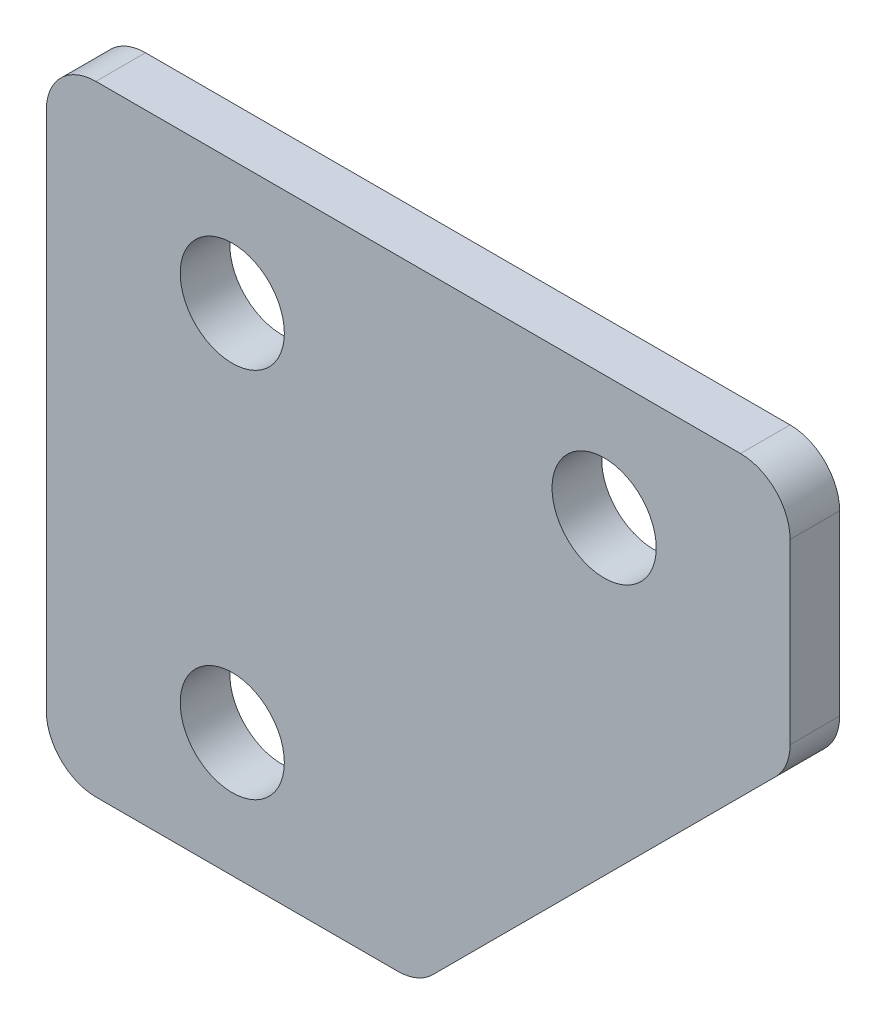
ISO-10303-21;
HEADER;
FILE_DESCRIPTION(('STEP AP214'),'2;1');
FILE_NAME('part.step','',(''),(''),'','','');
FILE_SCHEMA(('AUTOMOTIVE_DESIGN { 1 0 10303 214 1 1 1 1 }'));
ENDSEC;
DATA;
#1=APPLICATION_CONTEXT('core data for automotive mechanical design processes');
#2=APPLICATION_PROTOCOL_DEFINITION('international standard','automotive_design',2000,#1);
#3=PRODUCT_CONTEXT('',#1,'mechanical');
#4=PRODUCT('Part','Part','',(#3));
#5=PRODUCT_RELATED_PRODUCT_CATEGORY('part','',(#4));
#6=PRODUCT_DEFINITION_FORMATION('','',#4);
#7=PRODUCT_DEFINITION_CONTEXT('part definition',#1,'design');
#8=PRODUCT_DEFINITION('design','',#6,#7);
#9=PRODUCT_DEFINITION_SHAPE('','',#8);
#10=(LENGTH_UNIT() NAMED_UNIT(*) SI_UNIT(.MILLI.,.METRE.));
#11=(NAMED_UNIT(*) PLANE_ANGLE_UNIT() SI_UNIT($,.RADIAN.));
#12=(NAMED_UNIT(*) SI_UNIT($,.STERADIAN.) SOLID_ANGLE_UNIT());
#13=UNCERTAINTY_MEASURE_WITH_UNIT(LENGTH_MEASURE(1.E-05),#10,'distance_accuracy_value','');
#14=(GEOMETRIC_REPRESENTATION_CONTEXT(3) GLOBAL_UNCERTAINTY_ASSIGNED_CONTEXT((#13)) GLOBAL_UNIT_ASSIGNED_CONTEXT((#10,
#11,#12)) REPRESENTATION_CONTEXT('',''));
#15=CARTESIAN_POINT('',(0.,0.,0.));
#16=DIRECTION('',(0.,0.,1.));
#17=DIRECTION('',(1.,0.,0.));
#18=AXIS2_PLACEMENT_3D('',#15,#16,#17);
#19=CARTESIAN_POINT('',(13.75,-13.75,2.));
#20=DIRECTION('',(0.707106781186548,-0.707106781186547,0.));
#21=DIRECTION('',(0.707106781186547,0.707106781186548,0.));
#22=AXIS2_PLACEMENT_3D('',#19,#20,#21);
#23=PLANE('',#22);
#24=DIRECTION('',(-0.707106781186547,-0.707106781186548,0.));
#25=VECTOR('',#24,1.);
#26=CARTESIAN_POINT('',(13.75,-13.75,0.));
#27=LINE('',#26,#25);
#28=CARTESIAN_POINT('',(21.9142135623731,-5.58578643762691,0.));
#29=VERTEX_POINT('',#28);
#30=CARTESIAN_POINT('',(8.08578643762691,-19.4142135623731,0.));
#31=VERTEX_POINT('',#30);
#32=EDGE_CURVE('E205',#29,#31,#27,.T.);
#33=ORIENTED_EDGE('',*,*,#32,.F.);
#34=DIRECTION('',(0.,0.,-1.));
#35=VECTOR('',#34,1.);
#36=CARTESIAN_POINT('',(21.9142135623731,-5.58578643762691,2.));
#37=LINE('',#36,#35);
#38=CARTESIAN_POINT('',(21.9142135623731,-5.58578643762691,2.));
#39=VERTEX_POINT('',#38);
#40=EDGE_CURVE('E246',#29,#39,#37,.F.);
#41=ORIENTED_EDGE('',*,*,#40,.T.);
#42=DIRECTION('',(-0.707106781186547,-0.707106781186548,0.));
#43=VECTOR('',#42,1.);
#44=CARTESIAN_POINT('',(13.75,-13.75,2.));
#45=LINE('',#44,#43);
#46=CARTESIAN_POINT('',(8.08578643762691,-19.4142135623731,2.));
#47=VERTEX_POINT('',#46);
#48=EDGE_CURVE('E220',#39,#47,#45,.T.);
#49=ORIENTED_EDGE('',*,*,#48,.T.);
#50=DIRECTION('',(0.,0.,-1.));
#51=VECTOR('',#50,1.);
#52=CARTESIAN_POINT('',(8.08578643762691,-19.4142135623731,0.));
#53=LINE('',#52,#51);
#54=EDGE_CURVE('E248',#47,#31,#53,.T.);
#55=ORIENTED_EDGE('',*,*,#54,.T.);
#56=EDGE_LOOP('',(#33,#41,#49,#55));
#57=FACE_BOUND('',#56,.T.);
#58=ADVANCED_FACE('F39',(#57),#23,.T.);
#59=CARTESIAN_POINT('',(22.5,0.,2.));
#60=DIRECTION('',(1.,0.,0.));
#61=DIRECTION('',(0.,0.,-1.));
#62=AXIS2_PLACEMENT_3D('',#59,#60,#61);
#63=PLANE('',#62);
#64=DIRECTION('',(0.,-1.,0.));
#65=VECTOR('',#64,1.);
#66=CARTESIAN_POINT('',(22.5,0.,0.));
#67=LINE('',#66,#65);
#68=CARTESIAN_POINT('',(22.5,3.,0.));
#69=VERTEX_POINT('',#68);
#70=CARTESIAN_POINT('',(22.5,-4.17157287525381,0.));
#71=VERTEX_POINT('',#70);
#72=EDGE_CURVE('E138',#69,#71,#67,.T.);
#73=ORIENTED_EDGE('',*,*,#72,.F.);
#74=DIRECTION('',(0.,0.,-1.));
#75=VECTOR('',#74,1.);
#76=CARTESIAN_POINT('',(22.5,3.,2.));
#77=LINE('',#76,#75);
#78=CARTESIAN_POINT('',(22.5,3.,2.));
#79=VERTEX_POINT('',#78);
#80=EDGE_CURVE('E161',#69,#79,#77,.F.);
#81=ORIENTED_EDGE('',*,*,#80,.T.);
#82=DIRECTION('',(0.,-1.,0.));
#83=VECTOR('',#82,1.);
#84=CARTESIAN_POINT('',(22.5,0.,2.));
#85=LINE('',#84,#83);
#86=CARTESIAN_POINT('',(22.5,-4.17157287525381,2.));
#87=VERTEX_POINT('',#86);
#88=EDGE_CURVE('E224',#79,#87,#85,.T.);
#89=ORIENTED_EDGE('',*,*,#88,.T.);
#90=DIRECTION('',(0.,0.,-1.));
#91=VECTOR('',#90,1.);
#92=CARTESIAN_POINT('',(22.5,-4.17157287525381,2.));
#93=LINE('',#92,#91);
#94=EDGE_CURVE('E158',#87,#71,#93,.T.);
#95=ORIENTED_EDGE('',*,*,#94,.T.);
#96=EDGE_LOOP('',(#73,#81,#89,#95));
#97=FACE_BOUND('',#96,.T.);
#98=ADVANCED_FACE('F241',(#97),#63,.T.);
#99=CARTESIAN_POINT('',(0.,5.,2.));
#100=DIRECTION('',(0.,1.,0.));
#101=DIRECTION('',(0.,0.,1.));
#102=AXIS2_PLACEMENT_3D('',#99,#100,#101);
#103=PLANE('',#102);
#104=DIRECTION('',(1.,0.,0.));
#105=VECTOR('',#104,1.);
#106=CARTESIAN_POINT('',(0.,5.,2.));
#107=LINE('',#106,#105);
#108=CARTESIAN_POINT('',(-5.5,5.,2.));
#109=VERTEX_POINT('',#108);
#110=CARTESIAN_POINT('',(20.5,5.,2.));
#111=VERTEX_POINT('',#110);
#112=EDGE_CURVE('E179',#109,#111,#107,.T.);
#113=ORIENTED_EDGE('',*,*,#112,.T.);
#114=DIRECTION('',(0.,0.,-1.));
#115=VECTOR('',#114,1.);
#116=CARTESIAN_POINT('',(20.5,5.,2.));
#117=LINE('',#116,#115);
#118=CARTESIAN_POINT('',(20.5,5.,0.));
#119=VERTEX_POINT('',#118);
#120=EDGE_CURVE('E129',#111,#119,#117,.T.);
#121=ORIENTED_EDGE('',*,*,#120,.T.);
#122=DIRECTION('',(1.,0.,0.));
#123=VECTOR('',#122,1.);
#124=CARTESIAN_POINT('',(0.,5.,0.));
#125=LINE('',#124,#123);
#126=CARTESIAN_POINT('',(-5.5,5.,0.));
#127=VERTEX_POINT('',#126);
#128=EDGE_CURVE('E121',#127,#119,#125,.T.);
#129=ORIENTED_EDGE('',*,*,#128,.F.);
#130=DIRECTION('',(0.,0.,-1.));
#131=VECTOR('',#130,1.);
#132=CARTESIAN_POINT('',(-5.5,5.,2.));
#133=LINE('',#132,#131);
#134=EDGE_CURVE('E135',#127,#109,#133,.F.);
#135=ORIENTED_EDGE('',*,*,#134,.T.);
#136=EDGE_LOOP('',(#113,#121,#129,#135));
#137=FACE_BOUND('',#136,.T.);
#138=ADVANCED_FACE('F134',(#137),#103,.T.);
#139=CARTESIAN_POINT('',(-7.5,0.,2.));
#140=DIRECTION('',(1.,0.,0.));
#141=DIRECTION('',(0.,1.,0.));
#142=AXIS2_PLACEMENT_3D('',#139,#140,#141);
#143=PLANE('',#142);
#144=DIRECTION('',(0.,-1.,0.));
#145=VECTOR('',#144,1.);
#146=CARTESIAN_POINT('',(-7.5,0.,0.));
#147=LINE('',#146,#145);
#148=CARTESIAN_POINT('',(-7.5,3.,0.));
#149=VERTEX_POINT('',#148);
#150=CARTESIAN_POINT('',(-7.49999999999999,-18.,0.));
#151=VERTEX_POINT('',#150);
#152=EDGE_CURVE('E123',#149,#151,#147,.T.);
#153=ORIENTED_EDGE('',*,*,#152,.T.);
#154=DIRECTION('',(0.,0.,-1.));
#155=VECTOR('',#154,1.);
#156=CARTESIAN_POINT('',(-7.49999999999999,-18.,2.));
#157=LINE('',#156,#155);
#158=CARTESIAN_POINT('',(-7.49999999999999,-18.,2.));
#159=VERTEX_POINT('',#158);
#160=EDGE_CURVE('E12',#151,#159,#157,.F.);
#161=ORIENTED_EDGE('',*,*,#160,.T.);
#162=DIRECTION('',(0.,-1.,0.));
#163=VECTOR('',#162,1.);
#164=CARTESIAN_POINT('',(-7.5,0.,2.));
#165=LINE('',#164,#163);
#166=CARTESIAN_POINT('',(-7.5,3.,2.));
#167=VERTEX_POINT('',#166);
#168=EDGE_CURVE('E175',#167,#159,#165,.T.);
#169=ORIENTED_EDGE('',*,*,#168,.F.);
#170=DIRECTION('',(0.,0.,-1.));
#171=VECTOR('',#170,1.);
#172=CARTESIAN_POINT('',(-7.5,3.,0.));
#173=LINE('',#172,#171);
#174=EDGE_CURVE('E47',#167,#149,#173,.T.);
#175=ORIENTED_EDGE('',*,*,#174,.T.);
#176=EDGE_LOOP('',(#153,#161,#169,#175));
#177=FACE_BOUND('',#176,.T.);
#178=ADVANCED_FACE('F258',(#177),#143,.F.);
#179=CARTESIAN_POINT('',(0.,0.,2.));
#180=DIRECTION('',(0.,0.,-1.));
#181=DIRECTION('',(-1.,0.,0.));
#182=AXIS2_PLACEMENT_3D('',#179,#180,#181);
#183=CYLINDRICAL_SURFACE('',#182,2.1);
#184=CARTESIAN_POINT('',(0.,0.,2.));
#185=DIRECTION('',(0.,0.,1.));
#186=DIRECTION('',(1.,0.,0.));
#187=AXIS2_PLACEMENT_3D('',#184,#185,#186);
#188=CIRCLE('',#187,2.1);
#189=CARTESIAN_POINT('',(2.1,0.,2.));
#190=VERTEX_POINT('',#189);
#191=EDGE_CURVE('E146',#190,#190,#188,.T.);
#192=ORIENTED_EDGE('',*,*,#191,.T.);
#193=EDGE_LOOP('',(#192));
#194=FACE_BOUND('',#193,.T.);
#195=CARTESIAN_POINT('',(0.,0.,0.));
#196=DIRECTION('',(0.,0.,1.));
#197=DIRECTION('',(1.,0.,0.));
#198=AXIS2_PLACEMENT_3D('',#195,#196,#197);
#199=CIRCLE('',#198,2.1);
#200=CARTESIAN_POINT('',(2.1,0.,0.));
#201=VERTEX_POINT('',#200);
#202=EDGE_CURVE('E215',#201,#201,#199,.T.);
#203=ORIENTED_EDGE('',*,*,#202,.F.);
#204=EDGE_LOOP('',(#203));
#205=FACE_BOUND('',#204,.T.);
#206=ADVANCED_FACE('F297',(#194,#205),#183,.F.);
#207=CARTESIAN_POINT('',(0.,-15.,2.));
#208=DIRECTION('',(0.,0.,-1.));
#209=DIRECTION('',(-1.,0.,0.));
#210=AXIS2_PLACEMENT_3D('',#207,#208,#209);
#211=CYLINDRICAL_SURFACE('',#210,2.1);
#212=CARTESIAN_POINT('',(0.,-15.,2.));
#213=DIRECTION('',(0.,0.,1.));
#214=DIRECTION('',(1.,0.,0.));
#215=AXIS2_PLACEMENT_3D('',#212,#213,#214);
#216=CIRCLE('',#215,2.1);
#217=CARTESIAN_POINT('',(2.1,-15.,2.));
#218=VERTEX_POINT('',#217);
#219=EDGE_CURVE('E184',#218,#218,#216,.T.);
#220=ORIENTED_EDGE('',*,*,#219,.T.);
#221=EDGE_LOOP('',(#220));
#222=FACE_BOUND('',#221,.T.);
#223=CARTESIAN_POINT('',(0.,-15.,0.));
#224=DIRECTION('',(0.,0.,1.));
#225=DIRECTION('',(1.,0.,0.));
#226=AXIS2_PLACEMENT_3D('',#223,#224,#225);
#227=CIRCLE('',#226,2.1);
#228=CARTESIAN_POINT('',(2.1,-15.,0.));
#229=VERTEX_POINT('',#228);
#230=EDGE_CURVE('E213',#229,#229,#227,.T.);
#231=ORIENTED_EDGE('',*,*,#230,.F.);
#232=EDGE_LOOP('',(#231));
#233=FACE_BOUND('',#232,.T.);
#234=ADVANCED_FACE('F300',(#222,#233),#211,.F.);
#235=CARTESIAN_POINT('',(0.,-20.,2.));
#236=DIRECTION('',(0.,1.,0.));
#237=DIRECTION('',(0.,0.,1.));
#238=AXIS2_PLACEMENT_3D('',#235,#236,#237);
#239=PLANE('',#238);
#240=DIRECTION('',(1.,0.,0.));
#241=VECTOR('',#240,1.);
#242=CARTESIAN_POINT('',(0.,-20.,0.));
#243=LINE('',#242,#241);
#244=CARTESIAN_POINT('',(-5.49999999999999,-20.,0.));
#245=VERTEX_POINT('',#244);
#246=CARTESIAN_POINT('',(6.67157287525381,-20.,0.));
#247=VERTEX_POINT('',#246);
#248=EDGE_CURVE('E211',#245,#247,#243,.T.);
#249=ORIENTED_EDGE('',*,*,#248,.T.);
#250=DIRECTION('',(0.,0.,-1.));
#251=VECTOR('',#250,1.);
#252=CARTESIAN_POINT('',(6.67157287525381,-20.,2.));
#253=LINE('',#252,#251);
#254=CARTESIAN_POINT('',(6.67157287525381,-20.,2.));
#255=VERTEX_POINT('',#254);
#256=EDGE_CURVE('E54',#247,#255,#253,.F.);
#257=ORIENTED_EDGE('',*,*,#256,.T.);
#258=DIRECTION('',(1.,0.,0.));
#259=VECTOR('',#258,1.);
#260=CARTESIAN_POINT('',(0.,-20.,2.));
#261=LINE('',#260,#259);
#262=CARTESIAN_POINT('',(-5.49999999999999,-20.,2.));
#263=VERTEX_POINT('',#262);
#264=EDGE_CURVE('E178',#263,#255,#261,.T.);
#265=ORIENTED_EDGE('',*,*,#264,.F.);
#266=DIRECTION('',(0.,0.,-1.));
#267=VECTOR('',#266,1.);
#268=CARTESIAN_POINT('',(-5.49999999999999,-20.,2.));
#269=LINE('',#268,#267);
#270=EDGE_CURVE('E251',#263,#245,#269,.T.);
#271=ORIENTED_EDGE('',*,*,#270,.T.);
#272=EDGE_LOOP('',(#249,#257,#265,#271));
#273=FACE_BOUND('',#272,.T.);
#274=ADVANCED_FACE('F266',(#273),#239,.F.);
#275=CARTESIAN_POINT('',(15.,0.,2.));
#276=DIRECTION('',(0.,0.,-1.));
#277=DIRECTION('',(-1.,0.,0.));
#278=AXIS2_PLACEMENT_3D('',#275,#276,#277);
#279=CYLINDRICAL_SURFACE('',#278,2.1);
#280=CARTESIAN_POINT('',(15.,0.,2.));
#281=DIRECTION('',(0.,0.,1.));
#282=DIRECTION('',(1.,0.,0.));
#283=AXIS2_PLACEMENT_3D('',#280,#281,#282);
#284=CIRCLE('',#283,2.1);
#285=CARTESIAN_POINT('',(17.1,0.,2.));
#286=VERTEX_POINT('',#285);
#287=EDGE_CURVE('E142',#286,#286,#284,.T.);
#288=ORIENTED_EDGE('',*,*,#287,.T.);
#289=EDGE_LOOP('',(#288));
#290=FACE_BOUND('',#289,.T.);
#291=CARTESIAN_POINT('',(15.,0.,0.));
#292=DIRECTION('',(0.,0.,1.));
#293=DIRECTION('',(1.,0.,0.));
#294=AXIS2_PLACEMENT_3D('',#291,#292,#293);
#295=CIRCLE('',#294,2.1);
#296=CARTESIAN_POINT('',(17.1,0.,0.));
#297=VERTEX_POINT('',#296);
#298=EDGE_CURVE('E148',#297,#297,#295,.T.);
#299=ORIENTED_EDGE('',*,*,#298,.F.);
#300=EDGE_LOOP('',(#299));
#301=FACE_BOUND('',#300,.T.);
#302=ADVANCED_FACE('F291',(#290,#301),#279,.F.);
#303=CARTESIAN_POINT('',(0.,0.,2.));
#304=DIRECTION('',(0.,0.,1.));
#305=DIRECTION('',(1.,0.,0.));
#306=AXIS2_PLACEMENT_3D('',#303,#304,#305);
#307=PLANE('',#306);
#308=ORIENTED_EDGE('',*,*,#88,.F.);
#309=CARTESIAN_POINT('',(20.5,3.,2.));
#310=DIRECTION('',(0.,0.,1.));
#311=DIRECTION('',(1.,0.,0.));
#312=AXIS2_PLACEMENT_3D('',#309,#310,#311);
#313=CIRCLE('',#312,2.);
#314=EDGE_CURVE('E197',#79,#111,#313,.T.);
#315=ORIENTED_EDGE('',*,*,#314,.T.);
#316=ORIENTED_EDGE('',*,*,#112,.F.);
#317=CARTESIAN_POINT('',(-5.5,3.,2.));
#318=DIRECTION('',(0.,0.,1.));
#319=DIRECTION('',(1.,0.,0.));
#320=AXIS2_PLACEMENT_3D('',#317,#318,#319);
#321=CIRCLE('',#320,2.);
#322=EDGE_CURVE('E141',#109,#167,#321,.T.);
#323=ORIENTED_EDGE('',*,*,#322,.T.);
#324=ORIENTED_EDGE('',*,*,#168,.T.);
#325=CARTESIAN_POINT('',(-5.49999999999999,-18.,2.));
#326=DIRECTION('',(0.,0.,1.));
#327=DIRECTION('',(1.,0.,0.));
#328=AXIS2_PLACEMENT_3D('',#325,#326,#327);
#329=CIRCLE('',#328,2.);
#330=EDGE_CURVE('E61',#159,#263,#329,.T.);
#331=ORIENTED_EDGE('',*,*,#330,.T.);
#332=ORIENTED_EDGE('',*,*,#264,.T.);
#333=CARTESIAN_POINT('',(6.67157287525381,-18.,2.));
#334=DIRECTION('',(0.,0.,1.));
#335=DIRECTION('',(1.,0.,0.));
#336=AXIS2_PLACEMENT_3D('',#333,#334,#335);
#337=CIRCLE('',#336,2.);
#338=EDGE_CURVE('E191',#255,#47,#337,.T.);
#339=ORIENTED_EDGE('',*,*,#338,.T.);
#340=ORIENTED_EDGE('',*,*,#48,.F.);
#341=CARTESIAN_POINT('',(20.5,-4.17157287525381,2.));
#342=DIRECTION('',(0.,0.,1.));
#343=DIRECTION('',(1.,0.,0.));
#344=AXIS2_PLACEMENT_3D('',#341,#342,#343);
#345=CIRCLE('',#344,2.);
#346=EDGE_CURVE('E194',#39,#87,#345,.T.);
#347=ORIENTED_EDGE('',*,*,#346,.T.);
#348=EDGE_LOOP('',(#308,#315,#316,#323,#324,#331,#332,#339,#340,#347));
#349=FACE_BOUND('',#348,.T.);
#350=ORIENTED_EDGE('',*,*,#219,.F.);
#351=EDGE_LOOP('',(#350));
#352=FACE_BOUND('',#351,.T.);
#353=ORIENTED_EDGE('',*,*,#191,.F.);
#354=EDGE_LOOP('',(#353));
#355=FACE_BOUND('',#354,.T.);
#356=ORIENTED_EDGE('',*,*,#287,.F.);
#357=EDGE_LOOP('',(#356));
#358=FACE_BOUND('',#357,.T.);
#359=ADVANCED_FACE('F260',(#349,#352,#355,#358),#307,.T.);
#360=CARTESIAN_POINT('',(0.,0.,0.));
#361=DIRECTION('',(0.,0.,1.));
#362=DIRECTION('',(1.,0.,0.));
#363=AXIS2_PLACEMENT_3D('',#360,#361,#362);
#364=PLANE('',#363);
#365=ORIENTED_EDGE('',*,*,#128,.T.);
#366=CARTESIAN_POINT('',(20.5,3.,0.));
#367=DIRECTION('',(0.,0.,1.));
#368=DIRECTION('',(1.,0.,0.));
#369=AXIS2_PLACEMENT_3D('',#366,#367,#368);
#370=CIRCLE('',#369,2.);
#371=EDGE_CURVE('E156',#119,#69,#370,.F.);
#372=ORIENTED_EDGE('',*,*,#371,.T.);
#373=ORIENTED_EDGE('',*,*,#72,.T.);
#374=CARTESIAN_POINT('',(20.5,-4.17157287525381,0.));
#375=DIRECTION('',(0.,0.,1.));
#376=DIRECTION('',(1.,0.,0.));
#377=AXIS2_PLACEMENT_3D('',#374,#375,#376);
#378=CIRCLE('',#377,2.);
#379=EDGE_CURVE('E154',#71,#29,#378,.F.);
#380=ORIENTED_EDGE('',*,*,#379,.T.);
#381=ORIENTED_EDGE('',*,*,#32,.T.);
#382=CARTESIAN_POINT('',(6.67157287525381,-18.,0.));
#383=DIRECTION('',(0.,0.,1.));
#384=DIRECTION('',(1.,0.,0.));
#385=AXIS2_PLACEMENT_3D('',#382,#383,#384);
#386=CIRCLE('',#385,2.);
#387=EDGE_CURVE('E152',#31,#247,#386,.F.);
#388=ORIENTED_EDGE('',*,*,#387,.T.);
#389=ORIENTED_EDGE('',*,*,#248,.F.);
#390=CARTESIAN_POINT('',(-5.49999999999999,-18.,0.));
#391=DIRECTION('',(0.,0.,1.));
#392=DIRECTION('',(1.,0.,0.));
#393=AXIS2_PLACEMENT_3D('',#390,#391,#392);
#394=CIRCLE('',#393,2.);
#395=EDGE_CURVE('E128',#245,#151,#394,.F.);
#396=ORIENTED_EDGE('',*,*,#395,.T.);
#397=ORIENTED_EDGE('',*,*,#152,.F.);
#398=CARTESIAN_POINT('',(-5.5,3.,0.));
#399=DIRECTION('',(0.,0.,1.));
#400=DIRECTION('',(1.,0.,0.));
#401=AXIS2_PLACEMENT_3D('',#398,#399,#400);
#402=CIRCLE('',#401,2.);
#403=EDGE_CURVE('E117',#149,#127,#402,.F.);
#404=ORIENTED_EDGE('',*,*,#403,.T.);
#405=EDGE_LOOP('',(#365,#372,#373,#380,#381,#388,#389,#396,#397,#404));
#406=FACE_BOUND('',#405,.T.);
#407=ORIENTED_EDGE('',*,*,#230,.T.);
#408=EDGE_LOOP('',(#407));
#409=FACE_BOUND('',#408,.T.);
#410=ORIENTED_EDGE('',*,*,#202,.T.);
#411=EDGE_LOOP('',(#410));
#412=FACE_BOUND('',#411,.T.);
#413=ORIENTED_EDGE('',*,*,#298,.T.);
#414=EDGE_LOOP('',(#413));
#415=FACE_BOUND('',#414,.T.);
#416=ADVANCED_FACE('F119',(#406,#409,#412,#415),#364,.F.);
#417=CARTESIAN_POINT('',(20.5,3.,2.));
#418=DIRECTION('',(0.,0.,-1.));
#419=DIRECTION('',(-1.,0.,0.));
#420=AXIS2_PLACEMENT_3D('',#417,#418,#419);
#421=CYLINDRICAL_SURFACE('',#420,2.);
#422=ORIENTED_EDGE('',*,*,#314,.F.);
#423=ORIENTED_EDGE('',*,*,#80,.F.);
#424=ORIENTED_EDGE('',*,*,#371,.F.);
#425=ORIENTED_EDGE('',*,*,#120,.F.);
#426=EDGE_LOOP('',(#422,#423,#424,#425));
#427=FACE_BOUND('',#426,.T.);
#428=ADVANCED_FACE('F238',(#427),#421,.T.);
#429=CARTESIAN_POINT('',(20.5,-4.17157287525381,2.));
#430=DIRECTION('',(0.,0.,-1.));
#431=DIRECTION('',(-1.,0.,0.));
#432=AXIS2_PLACEMENT_3D('',#429,#430,#431);
#433=CYLINDRICAL_SURFACE('',#432,2.);
#434=ORIENTED_EDGE('',*,*,#346,.F.);
#435=ORIENTED_EDGE('',*,*,#40,.F.);
#436=ORIENTED_EDGE('',*,*,#379,.F.);
#437=ORIENTED_EDGE('',*,*,#94,.F.);
#438=EDGE_LOOP('',(#434,#435,#436,#437));
#439=FACE_BOUND('',#438,.T.);
#440=ADVANCED_FACE('F244',(#439),#433,.T.);
#441=CARTESIAN_POINT('',(6.67157287525381,-18.,2.));
#442=DIRECTION('',(0.,0.,1.));
#443=DIRECTION('',(1.,0.,0.));
#444=AXIS2_PLACEMENT_3D('',#441,#442,#443);
#445=CYLINDRICAL_SURFACE('',#444,2.);
#446=ORIENTED_EDGE('',*,*,#338,.F.);
#447=ORIENTED_EDGE('',*,*,#256,.F.);
#448=ORIENTED_EDGE('',*,*,#387,.F.);
#449=ORIENTED_EDGE('',*,*,#54,.F.);
#450=EDGE_LOOP('',(#446,#447,#448,#449));
#451=FACE_BOUND('',#450,.T.);
#452=ADVANCED_FACE('F267',(#451),#445,.T.);
#453=CARTESIAN_POINT('',(-5.49999999999999,-18.,2.));
#454=DIRECTION('',(0.,0.,-1.));
#455=DIRECTION('',(-1.,0.,0.));
#456=AXIS2_PLACEMENT_3D('',#453,#454,#455);
#457=CYLINDRICAL_SURFACE('',#456,2.);
#458=ORIENTED_EDGE('',*,*,#330,.F.);
#459=ORIENTED_EDGE('',*,*,#160,.F.);
#460=ORIENTED_EDGE('',*,*,#395,.F.);
#461=ORIENTED_EDGE('',*,*,#270,.F.);
#462=EDGE_LOOP('',(#458,#459,#460,#461));
#463=FACE_BOUND('',#462,.T.);
#464=ADVANCED_FACE('F264',(#463),#457,.T.);
#465=CARTESIAN_POINT('',(-5.5,3.,2.));
#466=DIRECTION('',(0.,0.,1.));
#467=DIRECTION('',(1.,0.,0.));
#468=AXIS2_PLACEMENT_3D('',#465,#466,#467);
#469=CYLINDRICAL_SURFACE('',#468,2.);
#470=ORIENTED_EDGE('',*,*,#322,.F.);
#471=ORIENTED_EDGE('',*,*,#134,.F.);
#472=ORIENTED_EDGE('',*,*,#403,.F.);
#473=ORIENTED_EDGE('',*,*,#174,.F.);
#474=EDGE_LOOP('',(#470,#471,#472,#473));
#475=FACE_BOUND('',#474,.T.);
#476=ADVANCED_FACE('F41',(#475),#469,.T.);
#477=CLOSED_SHELL('',(#58,#98,#138,#178,#206,#234,#274,#302,#359,#416,#428,#440,#452,#464,#476));
#478=MANIFOLD_SOLID_BREP('B2',#477);
#479=ADVANCED_BREP_SHAPE_REPRESENTATION('',(#18,#478),#14);
#480=SHAPE_DEFINITION_REPRESENTATION(#9,#479);
ENDSEC;
END-ISO-10303-21;
